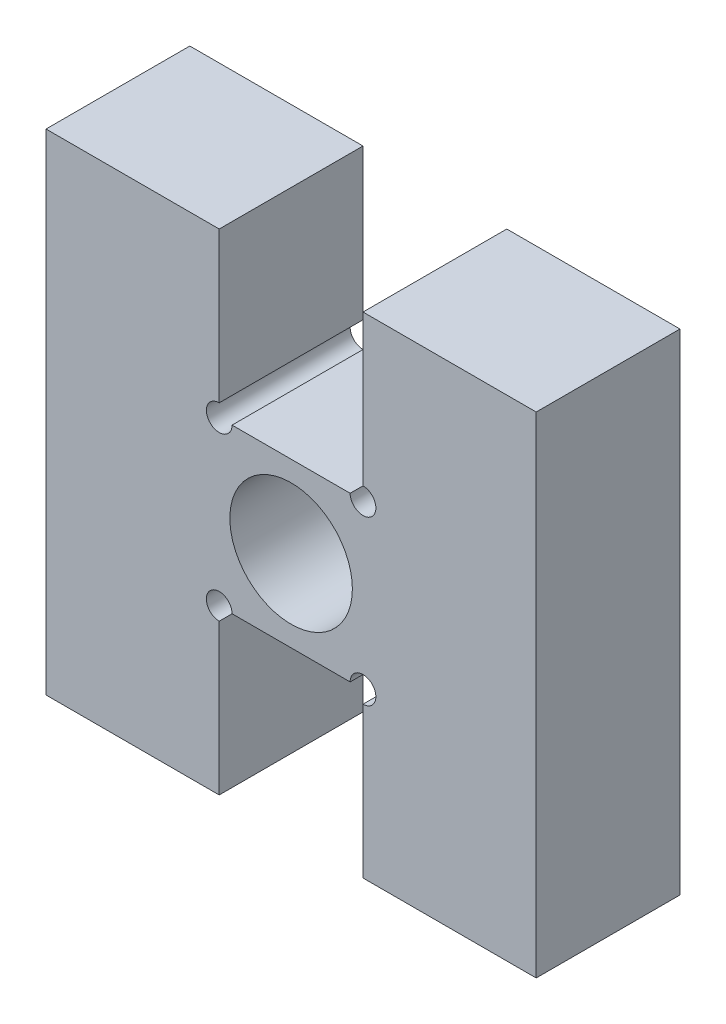
ISO-10303-21;
HEADER;
FILE_DESCRIPTION(('STEP AP214'),'2;1');
FILE_NAME('part.step','',(''),(''),'','','');
FILE_SCHEMA(('AUTOMOTIVE_DESIGN { 1 0 10303 214 1 1 1 1 }'));
ENDSEC;
DATA;
#1=APPLICATION_CONTEXT('core data for automotive mechanical design processes');
#2=APPLICATION_PROTOCOL_DEFINITION('international standard','automotive_design',2000,#1);
#3=PRODUCT_CONTEXT('',#1,'mechanical');
#4=PRODUCT('Part','Part','',(#3));
#5=PRODUCT_RELATED_PRODUCT_CATEGORY('part','',(#4));
#6=PRODUCT_DEFINITION_FORMATION('','',#4);
#7=PRODUCT_DEFINITION_CONTEXT('part definition',#1,'design');
#8=PRODUCT_DEFINITION('design','',#6,#7);
#9=PRODUCT_DEFINITION_SHAPE('','',#8);
#10=(LENGTH_UNIT() NAMED_UNIT(*) SI_UNIT(.MILLI.,.METRE.));
#11=(NAMED_UNIT(*) PLANE_ANGLE_UNIT() SI_UNIT($,.RADIAN.));
#12=(NAMED_UNIT(*) SI_UNIT($,.STERADIAN.) SOLID_ANGLE_UNIT());
#13=UNCERTAINTY_MEASURE_WITH_UNIT(LENGTH_MEASURE(1.E-05),#10,'distance_accuracy_value','');
#14=(GEOMETRIC_REPRESENTATION_CONTEXT(3) GLOBAL_UNCERTAINTY_ASSIGNED_CONTEXT((#13)) GLOBAL_UNIT_ASSIGNED_CONTEXT((#10,
#11,#12)) REPRESENTATION_CONTEXT('',''));
#15=CARTESIAN_POINT('',(0.,0.,0.));
#16=DIRECTION('',(0.,0.,1.));
#17=DIRECTION('',(1.,0.,0.));
#18=AXIS2_PLACEMENT_3D('',#15,#16,#17);
#19=CARTESIAN_POINT('',(-2.794,3.175,5.588));
#20=DIRECTION('',(0.,-1.,0.));
#21=DIRECTION('',(0.,0.,-1.));
#22=AXIS2_PLACEMENT_3D('',#19,#20,#21);
#23=PLANE('',#22);
#24=DIRECTION('',(0.,0.,-1.));
#25=VECTOR('',#24,1.);
#26=CARTESIAN_POINT('',(2.294,3.175,5.588));
#27=LINE('',#26,#25);
#28=CARTESIAN_POINT('',(2.294,3.175,0.));
#29=VERTEX_POINT('',#28);
#30=CARTESIAN_POINT('',(2.294,3.175,5.588));
#31=VERTEX_POINT('',#30);
#32=EDGE_CURVE('E143',#29,#31,#27,.F.);
#33=ORIENTED_EDGE('',*,*,#32,.F.);
#34=DIRECTION('',(-1.,0.,0.));
#35=VECTOR('',#34,1.);
#36=CARTESIAN_POINT('',(-2.794,3.175,0.));
#37=LINE('',#36,#35);
#38=CARTESIAN_POINT('',(-2.294,3.175,0.));
#39=VERTEX_POINT('',#38);
#40=EDGE_CURVE('E204',#29,#39,#37,.T.);
#41=ORIENTED_EDGE('',*,*,#40,.T.);
#42=DIRECTION('',(0.,0.,-1.));
#43=VECTOR('',#42,1.);
#44=CARTESIAN_POINT('',(-2.294,3.175,5.588));
#45=LINE('',#44,#43);
#46=CARTESIAN_POINT('',(-2.294,3.175,5.588));
#47=VERTEX_POINT('',#46);
#48=EDGE_CURVE('E170',#47,#39,#45,.T.);
#49=ORIENTED_EDGE('',*,*,#48,.F.);
#50=DIRECTION('',(-1.,0.,0.));
#51=VECTOR('',#50,1.);
#52=CARTESIAN_POINT('',(-2.794,3.175,5.588));
#53=LINE('',#52,#51);
#54=EDGE_CURVE('E163',#31,#47,#53,.T.);
#55=ORIENTED_EDGE('',*,*,#54,.F.);
#56=EDGE_LOOP('',(#33,#41,#49,#55));
#57=FACE_BOUND('',#56,.T.);
#58=ADVANCED_FACE('F33',(#57),#23,.F.);
#59=CARTESIAN_POINT('',(-2.794,3.175,5.588));
#60=DIRECTION('',(-1.,0.,0.));
#61=DIRECTION('',(0.,-1.,0.));
#62=AXIS2_PLACEMENT_3D('',#59,#60,#61);
#63=PLANE('',#62);
#64=DIRECTION('',(0.,0.,-1.));
#65=VECTOR('',#64,1.);
#66=CARTESIAN_POINT('',(-2.794,3.675,5.588));
#67=LINE('',#66,#65);
#68=CARTESIAN_POINT('',(-2.794,3.675,0.));
#69=VERTEX_POINT('',#68);
#70=CARTESIAN_POINT('',(-2.794,3.675,5.588));
#71=VERTEX_POINT('',#70);
#72=EDGE_CURVE('E11',#69,#71,#67,.F.);
#73=ORIENTED_EDGE('',*,*,#72,.F.);
#74=DIRECTION('',(0.,1.,0.));
#75=VECTOR('',#74,1.);
#76=CARTESIAN_POINT('',(-2.794,3.175,0.));
#77=LINE('',#76,#75);
#78=CARTESIAN_POINT('',(-2.794,9.525,0.));
#79=VERTEX_POINT('',#78);
#80=EDGE_CURVE('E206',#69,#79,#77,.T.);
#81=ORIENTED_EDGE('',*,*,#80,.T.);
#82=DIRECTION('',(0.,0.,-1.));
#83=VECTOR('',#82,1.);
#84=CARTESIAN_POINT('',(-2.794,9.525,5.588));
#85=LINE('',#84,#83);
#86=CARTESIAN_POINT('',(-2.794,9.525,5.588));
#87=VERTEX_POINT('',#86);
#88=EDGE_CURVE('E248',#87,#79,#85,.T.);
#89=ORIENTED_EDGE('',*,*,#88,.F.);
#90=DIRECTION('',(0.,1.,0.));
#91=VECTOR('',#90,1.);
#92=CARTESIAN_POINT('',(-2.794,3.175,5.588));
#93=LINE('',#92,#91);
#94=EDGE_CURVE('E171',#71,#87,#93,.T.);
#95=ORIENTED_EDGE('',*,*,#94,.F.);
#96=EDGE_LOOP('',(#73,#81,#89,#95));
#97=FACE_BOUND('',#96,.T.);
#98=ADVANCED_FACE('F299',(#97),#63,.F.);
#99=CARTESIAN_POINT('',(-2.794,-9.525,5.588));
#100=DIRECTION('',(-1.,0.,0.));
#101=DIRECTION('',(0.,-1.,0.));
#102=AXIS2_PLACEMENT_3D('',#99,#100,#101);
#103=PLANE('',#102);
#104=DIRECTION('',(0.,0.,-1.));
#105=VECTOR('',#104,1.);
#106=CARTESIAN_POINT('',(-2.794,-3.675,5.588));
#107=LINE('',#106,#105);
#108=CARTESIAN_POINT('',(-2.794,-3.675,5.588));
#109=VERTEX_POINT('',#108);
#110=CARTESIAN_POINT('',(-2.794,-3.675,0.));
#111=VERTEX_POINT('',#110);
#112=EDGE_CURVE('E269',#109,#111,#107,.T.);
#113=ORIENTED_EDGE('',*,*,#112,.F.);
#114=DIRECTION('',(0.,1.,0.));
#115=VECTOR('',#114,1.);
#116=CARTESIAN_POINT('',(-2.794,-9.525,5.588));
#117=LINE('',#116,#115);
#118=CARTESIAN_POINT('',(-2.794,-9.525,5.588));
#119=VERTEX_POINT('',#118);
#120=EDGE_CURVE('E188',#119,#109,#117,.T.);
#121=ORIENTED_EDGE('',*,*,#120,.F.);
#122=DIRECTION('',(0.,0.,-1.));
#123=VECTOR('',#122,1.);
#124=CARTESIAN_POINT('',(-2.794,-9.525,5.588));
#125=LINE('',#124,#123);
#126=CARTESIAN_POINT('',(-2.794,-9.525,0.));
#127=VERTEX_POINT('',#126);
#128=EDGE_CURVE('E239',#119,#127,#125,.T.);
#129=ORIENTED_EDGE('',*,*,#128,.T.);
#130=DIRECTION('',(0.,1.,0.));
#131=VECTOR('',#130,1.);
#132=CARTESIAN_POINT('',(-2.794,-9.525,0.));
#133=LINE('',#132,#131);
#134=EDGE_CURVE('E215',#127,#111,#133,.T.);
#135=ORIENTED_EDGE('',*,*,#134,.T.);
#136=EDGE_LOOP('',(#113,#121,#129,#135));
#137=FACE_BOUND('',#136,.T.);
#138=ADVANCED_FACE('F303',(#137),#103,.F.);
#139=CARTESIAN_POINT('',(-2.794,-3.175,5.588));
#140=DIRECTION('',(0.,1.,0.));
#141=DIRECTION('',(0.,0.,1.));
#142=AXIS2_PLACEMENT_3D('',#139,#140,#141);
#143=PLANE('',#142);
#144=DIRECTION('',(0.,0.,-1.));
#145=VECTOR('',#144,1.);
#146=CARTESIAN_POINT('',(-2.294,-3.175,5.588));
#147=LINE('',#146,#145);
#148=CARTESIAN_POINT('',(-2.294,-3.175,0.));
#149=VERTEX_POINT('',#148);
#150=CARTESIAN_POINT('',(-2.294,-3.175,5.588));
#151=VERTEX_POINT('',#150);
#152=EDGE_CURVE('E40',#149,#151,#147,.F.);
#153=ORIENTED_EDGE('',*,*,#152,.F.);
#154=DIRECTION('',(1.,0.,0.));
#155=VECTOR('',#154,1.);
#156=CARTESIAN_POINT('',(-2.794,-3.175,0.));
#157=LINE('',#156,#155);
#158=CARTESIAN_POINT('',(2.294,-3.175,0.));
#159=VERTEX_POINT('',#158);
#160=EDGE_CURVE('E218',#149,#159,#157,.T.);
#161=ORIENTED_EDGE('',*,*,#160,.T.);
#162=DIRECTION('',(0.,0.,-1.));
#163=VECTOR('',#162,1.);
#164=CARTESIAN_POINT('',(2.294,-3.175,5.588));
#165=LINE('',#164,#163);
#166=CARTESIAN_POINT('',(2.294,-3.175,5.588));
#167=VERTEX_POINT('',#166);
#168=EDGE_CURVE('E265',#167,#159,#165,.T.);
#169=ORIENTED_EDGE('',*,*,#168,.F.);
#170=DIRECTION('',(1.,0.,0.));
#171=VECTOR('',#170,1.);
#172=CARTESIAN_POINT('',(-2.794,-3.175,5.588));
#173=LINE('',#172,#171);
#174=EDGE_CURVE('E191',#151,#167,#173,.T.);
#175=ORIENTED_EDGE('',*,*,#174,.F.);
#176=EDGE_LOOP('',(#153,#161,#169,#175));
#177=FACE_BOUND('',#176,.T.);
#178=ADVANCED_FACE('F264',(#177),#143,.F.);
#179=CARTESIAN_POINT('',(2.794,-3.175,5.588));
#180=DIRECTION('',(1.,0.,0.));
#181=DIRECTION('',(0.,1.,0.));
#182=AXIS2_PLACEMENT_3D('',#179,#180,#181);
#183=PLANE('',#182);
#184=DIRECTION('',(0.,0.,-1.));
#185=VECTOR('',#184,1.);
#186=CARTESIAN_POINT('',(2.794,-3.675,5.588));
#187=LINE('',#186,#185);
#188=CARTESIAN_POINT('',(2.794,-3.675,0.));
#189=VERTEX_POINT('',#188);
#190=CARTESIAN_POINT('',(2.794,-3.675,5.588));
#191=VERTEX_POINT('',#190);
#192=EDGE_CURVE('E253',#189,#191,#187,.F.);
#193=ORIENTED_EDGE('',*,*,#192,.F.);
#194=DIRECTION('',(0.,-1.,0.));
#195=VECTOR('',#194,1.);
#196=CARTESIAN_POINT('',(2.794,-3.175,0.));
#197=LINE('',#196,#195);
#198=CARTESIAN_POINT('',(2.794,-9.525,0.));
#199=VERTEX_POINT('',#198);
#200=EDGE_CURVE('E221',#189,#199,#197,.T.);
#201=ORIENTED_EDGE('',*,*,#200,.T.);
#202=DIRECTION('',(0.,0.,-1.));
#203=VECTOR('',#202,1.);
#204=CARTESIAN_POINT('',(2.794,-9.525,5.588));
#205=LINE('',#204,#203);
#206=CARTESIAN_POINT('',(2.794,-9.525,5.588));
#207=VERTEX_POINT('',#206);
#208=EDGE_CURVE('E236',#207,#199,#205,.T.);
#209=ORIENTED_EDGE('',*,*,#208,.F.);
#210=DIRECTION('',(0.,-1.,0.));
#211=VECTOR('',#210,1.);
#212=CARTESIAN_POINT('',(2.794,-3.175,5.588));
#213=LINE('',#212,#211);
#214=EDGE_CURVE('E194',#191,#207,#213,.T.);
#215=ORIENTED_EDGE('',*,*,#214,.F.);
#216=EDGE_LOOP('',(#193,#201,#209,#215));
#217=FACE_BOUND('',#216,.T.);
#218=ADVANCED_FACE('F326',(#217),#183,.F.);
#219=CARTESIAN_POINT('',(2.794,9.525,5.588));
#220=DIRECTION('',(1.,0.,0.));
#221=DIRECTION('',(0.,1.,0.));
#222=AXIS2_PLACEMENT_3D('',#219,#220,#221);
#223=PLANE('',#222);
#224=DIRECTION('',(0.,0.,-1.));
#225=VECTOR('',#224,1.);
#226=CARTESIAN_POINT('',(2.794,3.675,5.588));
#227=LINE('',#226,#225);
#228=CARTESIAN_POINT('',(2.794,3.675,5.588));
#229=VERTEX_POINT('',#228);
#230=CARTESIAN_POINT('',(2.794,3.675,0.));
#231=VERTEX_POINT('',#230);
#232=EDGE_CURVE('E251',#229,#231,#227,.T.);
#233=ORIENTED_EDGE('',*,*,#232,.F.);
#234=DIRECTION('',(0.,-1.,0.));
#235=VECTOR('',#234,1.);
#236=CARTESIAN_POINT('',(2.794,9.525,5.588));
#237=LINE('',#236,#235);
#238=CARTESIAN_POINT('',(2.794,9.525,5.588));
#239=VERTEX_POINT('',#238);
#240=EDGE_CURVE('E165',#239,#229,#237,.T.);
#241=ORIENTED_EDGE('',*,*,#240,.F.);
#242=DIRECTION('',(0.,0.,-1.));
#243=VECTOR('',#242,1.);
#244=CARTESIAN_POINT('',(2.794,9.525,5.588));
#245=LINE('',#244,#243);
#246=CARTESIAN_POINT('',(2.794,9.525,0.));
#247=VERTEX_POINT('',#246);
#248=EDGE_CURVE('E203',#239,#247,#245,.T.);
#249=ORIENTED_EDGE('',*,*,#248,.T.);
#250=DIRECTION('',(0.,-1.,0.));
#251=VECTOR('',#250,1.);
#252=CARTESIAN_POINT('',(2.794,9.525,0.));
#253=LINE('',#252,#251);
#254=EDGE_CURVE('E172',#247,#231,#253,.T.);
#255=ORIENTED_EDGE('',*,*,#254,.T.);
#256=EDGE_LOOP('',(#233,#241,#249,#255));
#257=FACE_BOUND('',#256,.T.);
#258=ADVANCED_FACE('F329',(#257),#223,.F.);
#259=CARTESIAN_POINT('',(0.,0.,5.588));
#260=DIRECTION('',(0.,0.,-1.));
#261=DIRECTION('',(-1.,0.,0.));
#262=AXIS2_PLACEMENT_3D('',#259,#260,#261);
#263=PLANE('',#262);
#264=CARTESIAN_POINT('',(-2.794,-3.175,5.588));
#265=DIRECTION('',(0.,0.,1.));
#266=DIRECTION('',(1.,0.,0.));
#267=AXIS2_PLACEMENT_3D('',#264,#265,#266);
#268=CIRCLE('',#267,0.5);
#269=EDGE_CURVE('E255',#151,#109,#268,.T.);
#270=ORIENTED_EDGE('',*,*,#269,.F.);
#271=ORIENTED_EDGE('',*,*,#174,.T.);
#272=CARTESIAN_POINT('',(2.794,-3.175,5.588));
#273=DIRECTION('',(0.,0.,1.));
#274=DIRECTION('',(1.,0.,0.));
#275=AXIS2_PLACEMENT_3D('',#272,#273,#274);
#276=CIRCLE('',#275,0.5);
#277=EDGE_CURVE('E167',#191,#167,#276,.T.);
#278=ORIENTED_EDGE('',*,*,#277,.F.);
#279=ORIENTED_EDGE('',*,*,#214,.T.);
#280=DIRECTION('',(1.,0.,0.));
#281=VECTOR('',#280,1.);
#282=CARTESIAN_POINT('',(2.794,-9.525,5.588));
#283=LINE('',#282,#281);
#284=CARTESIAN_POINT('',(9.525,-9.525,5.588));
#285=VERTEX_POINT('',#284);
#286=EDGE_CURVE('E196',#207,#285,#283,.T.);
#287=ORIENTED_EDGE('',*,*,#286,.T.);
#288=DIRECTION('',(0.,1.,0.));
#289=VECTOR('',#288,1.);
#290=CARTESIAN_POINT('',(9.525,-9.525,5.588));
#291=LINE('',#290,#289);
#292=CARTESIAN_POINT('',(9.525,9.525,5.588));
#293=VERTEX_POINT('',#292);
#294=EDGE_CURVE('E198',#285,#293,#291,.T.);
#295=ORIENTED_EDGE('',*,*,#294,.T.);
#296=DIRECTION('',(-1.,0.,0.));
#297=VECTOR('',#296,1.);
#298=CARTESIAN_POINT('',(9.525,9.525,5.588));
#299=LINE('',#298,#297);
#300=EDGE_CURVE('E200',#293,#239,#299,.T.);
#301=ORIENTED_EDGE('',*,*,#300,.T.);
#302=ORIENTED_EDGE('',*,*,#240,.T.);
#303=CARTESIAN_POINT('',(2.794,3.175,5.588));
#304=DIRECTION('',(0.,0.,1.));
#305=DIRECTION('',(1.,0.,0.));
#306=AXIS2_PLACEMENT_3D('',#303,#304,#305);
#307=CIRCLE('',#306,0.5);
#308=EDGE_CURVE('E146',#31,#229,#307,.T.);
#309=ORIENTED_EDGE('',*,*,#308,.F.);
#310=ORIENTED_EDGE('',*,*,#54,.T.);
#311=CARTESIAN_POINT('',(-2.794,3.175,5.588));
#312=DIRECTION('',(0.,0.,1.));
#313=DIRECTION('',(1.,0.,0.));
#314=AXIS2_PLACEMENT_3D('',#311,#312,#313);
#315=CIRCLE('',#314,0.5);
#316=EDGE_CURVE('E166',#71,#47,#315,.T.);
#317=ORIENTED_EDGE('',*,*,#316,.F.);
#318=ORIENTED_EDGE('',*,*,#94,.T.);
#319=DIRECTION('',(-1.,0.,0.));
#320=VECTOR('',#319,1.);
#321=CARTESIAN_POINT('',(-2.794,9.525,5.588));
#322=LINE('',#321,#320);
#323=CARTESIAN_POINT('',(-9.525,9.525,5.588));
#324=VERTEX_POINT('',#323);
#325=EDGE_CURVE('E174',#87,#324,#322,.T.);
#326=ORIENTED_EDGE('',*,*,#325,.T.);
#327=DIRECTION('',(0.,-1.,0.));
#328=VECTOR('',#327,1.);
#329=CARTESIAN_POINT('',(-9.525,9.525,5.588));
#330=LINE('',#329,#328);
#331=CARTESIAN_POINT('',(-9.525,-9.525,5.588));
#332=VERTEX_POINT('',#331);
#333=EDGE_CURVE('E184',#324,#332,#330,.T.);
#334=ORIENTED_EDGE('',*,*,#333,.T.);
#335=DIRECTION('',(1.,0.,0.));
#336=VECTOR('',#335,1.);
#337=CARTESIAN_POINT('',(-9.525,-9.525,5.588));
#338=LINE('',#337,#336);
#339=EDGE_CURVE('E186',#332,#119,#338,.T.);
#340=ORIENTED_EDGE('',*,*,#339,.T.);
#341=ORIENTED_EDGE('',*,*,#120,.T.);
#342=EDGE_LOOP('',(#270,#271,#278,#279,#287,#295,#301,#302,#309,#310,#317,#318,#326,#334,#340,#341));
#343=FACE_BOUND('',#342,.T.);
#344=CARTESIAN_POINT('',(0.,0.,5.588));
#345=DIRECTION('',(0.,0.,1.));
#346=DIRECTION('',(1.,0.,0.));
#347=AXIS2_PLACEMENT_3D('',#344,#345,#346);
#348=CIRCLE('',#347,2.38125);
#349=CARTESIAN_POINT('',(2.38125,0.,5.588));
#350=VERTEX_POINT('',#349);
#351=EDGE_CURVE('E207',#350,#350,#348,.T.);
#352=ORIENTED_EDGE('',*,*,#351,.F.);
#353=EDGE_LOOP('',(#352));
#354=FACE_BOUND('',#353,.T.);
#355=ADVANCED_FACE('F160',(#343,#354),#263,.F.);
#356=CARTESIAN_POINT('',(0.,0.,0.));
#357=DIRECTION('',(0.,0.,-1.));
#358=DIRECTION('',(-1.,0.,0.));
#359=AXIS2_PLACEMENT_3D('',#356,#357,#358);
#360=PLANE('',#359);
#361=ORIENTED_EDGE('',*,*,#160,.F.);
#362=CARTESIAN_POINT('',(-2.794,-3.175,0.));
#363=DIRECTION('',(0.,0.,-1.));
#364=DIRECTION('',(-1.,0.,0.));
#365=AXIS2_PLACEMENT_3D('',#362,#363,#364);
#366=CIRCLE('',#365,0.5);
#367=EDGE_CURVE('E54',#149,#111,#366,.F.);
#368=ORIENTED_EDGE('',*,*,#367,.T.);
#369=ORIENTED_EDGE('',*,*,#134,.F.);
#370=DIRECTION('',(1.,0.,0.));
#371=VECTOR('',#370,1.);
#372=CARTESIAN_POINT('',(-9.525,-9.525,0.));
#373=LINE('',#372,#371);
#374=CARTESIAN_POINT('',(-9.525,-9.525,0.));
#375=VERTEX_POINT('',#374);
#376=EDGE_CURVE('E213',#375,#127,#373,.T.);
#377=ORIENTED_EDGE('',*,*,#376,.F.);
#378=DIRECTION('',(0.,-1.,0.));
#379=VECTOR('',#378,1.);
#380=CARTESIAN_POINT('',(-9.525,9.525,0.));
#381=LINE('',#380,#379);
#382=CARTESIAN_POINT('',(-9.525,9.525,0.));
#383=VERTEX_POINT('',#382);
#384=EDGE_CURVE('E211',#383,#375,#381,.T.);
#385=ORIENTED_EDGE('',*,*,#384,.F.);
#386=DIRECTION('',(-1.,0.,0.));
#387=VECTOR('',#386,1.);
#388=CARTESIAN_POINT('',(-2.794,9.525,0.));
#389=LINE('',#388,#387);
#390=EDGE_CURVE('E209',#79,#383,#389,.T.);
#391=ORIENTED_EDGE('',*,*,#390,.F.);
#392=ORIENTED_EDGE('',*,*,#80,.F.);
#393=CARTESIAN_POINT('',(-2.794,3.175,0.));
#394=DIRECTION('',(0.,0.,-1.));
#395=DIRECTION('',(-1.,0.,0.));
#396=AXIS2_PLACEMENT_3D('',#393,#394,#395);
#397=CIRCLE('',#396,0.5);
#398=EDGE_CURVE('E46',#69,#39,#397,.F.);
#399=ORIENTED_EDGE('',*,*,#398,.T.);
#400=ORIENTED_EDGE('',*,*,#40,.F.);
#401=CARTESIAN_POINT('',(2.794,3.175,0.));
#402=DIRECTION('',(0.,0.,-1.));
#403=DIRECTION('',(-1.,0.,0.));
#404=AXIS2_PLACEMENT_3D('',#401,#402,#403);
#405=CIRCLE('',#404,0.5);
#406=EDGE_CURVE('E149',#29,#231,#405,.F.);
#407=ORIENTED_EDGE('',*,*,#406,.T.);
#408=ORIENTED_EDGE('',*,*,#254,.F.);
#409=DIRECTION('',(-1.,0.,0.));
#410=VECTOR('',#409,1.);
#411=CARTESIAN_POINT('',(9.525,9.525,0.));
#412=LINE('',#411,#410);
#413=CARTESIAN_POINT('',(9.525,9.525,0.));
#414=VERTEX_POINT('',#413);
#415=EDGE_CURVE('E177',#414,#247,#412,.T.);
#416=ORIENTED_EDGE('',*,*,#415,.F.);
#417=DIRECTION('',(0.,1.,0.));
#418=VECTOR('',#417,1.);
#419=CARTESIAN_POINT('',(9.525,-9.525,0.));
#420=LINE('',#419,#418);
#421=CARTESIAN_POINT('',(9.525,-9.525,0.));
#422=VERTEX_POINT('',#421);
#423=EDGE_CURVE('E225',#422,#414,#420,.T.);
#424=ORIENTED_EDGE('',*,*,#423,.F.);
#425=DIRECTION('',(1.,0.,0.));
#426=VECTOR('',#425,1.);
#427=CARTESIAN_POINT('',(2.794,-9.525,0.));
#428=LINE('',#427,#426);
#429=EDGE_CURVE('E223',#199,#422,#428,.T.);
#430=ORIENTED_EDGE('',*,*,#429,.F.);
#431=ORIENTED_EDGE('',*,*,#200,.F.);
#432=CARTESIAN_POINT('',(2.794,-3.175,0.));
#433=DIRECTION('',(0.,0.,-1.));
#434=DIRECTION('',(-1.,0.,0.));
#435=AXIS2_PLACEMENT_3D('',#432,#433,#434);
#436=CIRCLE('',#435,0.5);
#437=EDGE_CURVE('E154',#189,#159,#436,.F.);
#438=ORIENTED_EDGE('',*,*,#437,.T.);
#439=EDGE_LOOP('',(#361,#368,#369,#377,#385,#391,#392,#399,#400,#407,#408,#416,#424,#430,#431,#438));
#440=FACE_BOUND('',#439,.T.);
#441=CARTESIAN_POINT('',(0.,0.,0.));
#442=DIRECTION('',(0.,0.,1.));
#443=DIRECTION('',(1.,0.,0.));
#444=AXIS2_PLACEMENT_3D('',#441,#442,#443);
#445=CIRCLE('',#444,2.38125);
#446=CARTESIAN_POINT('',(2.38125,0.,0.));
#447=VERTEX_POINT('',#446);
#448=EDGE_CURVE('E180',#447,#447,#445,.T.);
#449=ORIENTED_EDGE('',*,*,#448,.T.);
#450=EDGE_LOOP('',(#449));
#451=FACE_BOUND('',#450,.T.);
#452=ADVANCED_FACE('F281',(#440,#451),#360,.T.);
#453=CARTESIAN_POINT('',(-2.794,9.525,5.588));
#454=DIRECTION('',(0.,-1.,0.));
#455=DIRECTION('',(1.,0.,0.));
#456=AXIS2_PLACEMENT_3D('',#453,#454,#455);
#457=PLANE('',#456);
#458=ORIENTED_EDGE('',*,*,#390,.T.);
#459=DIRECTION('',(0.,0.,-1.));
#460=VECTOR('',#459,1.);
#461=CARTESIAN_POINT('',(-9.525,9.525,5.588));
#462=LINE('',#461,#460);
#463=EDGE_CURVE('E245',#324,#383,#462,.T.);
#464=ORIENTED_EDGE('',*,*,#463,.F.);
#465=ORIENTED_EDGE('',*,*,#325,.F.);
#466=ORIENTED_EDGE('',*,*,#88,.T.);
#467=EDGE_LOOP('',(#458,#464,#465,#466));
#468=FACE_BOUND('',#467,.T.);
#469=ADVANCED_FACE('F311',(#468),#457,.F.);
#470=CARTESIAN_POINT('',(-9.525,9.525,5.588));
#471=DIRECTION('',(1.,0.,0.));
#472=DIRECTION('',(0.,0.,-1.));
#473=AXIS2_PLACEMENT_3D('',#470,#471,#472);
#474=PLANE('',#473);
#475=ORIENTED_EDGE('',*,*,#384,.T.);
#476=DIRECTION('',(0.,0.,-1.));
#477=VECTOR('',#476,1.);
#478=CARTESIAN_POINT('',(-9.525,-9.525,5.588));
#479=LINE('',#478,#477);
#480=EDGE_CURVE('E242',#332,#375,#479,.T.);
#481=ORIENTED_EDGE('',*,*,#480,.F.);
#482=ORIENTED_EDGE('',*,*,#333,.F.);
#483=ORIENTED_EDGE('',*,*,#463,.T.);
#484=EDGE_LOOP('',(#475,#481,#482,#483));
#485=FACE_BOUND('',#484,.T.);
#486=ADVANCED_FACE('F314',(#485),#474,.F.);
#487=CARTESIAN_POINT('',(-9.525,-9.525,5.588));
#488=DIRECTION('',(0.,1.,0.));
#489=DIRECTION('',(-1.,0.,0.));
#490=AXIS2_PLACEMENT_3D('',#487,#488,#489);
#491=PLANE('',#490);
#492=ORIENTED_EDGE('',*,*,#376,.T.);
#493=ORIENTED_EDGE('',*,*,#128,.F.);
#494=ORIENTED_EDGE('',*,*,#339,.F.);
#495=ORIENTED_EDGE('',*,*,#480,.T.);
#496=EDGE_LOOP('',(#492,#493,#494,#495));
#497=FACE_BOUND('',#496,.T.);
#498=ADVANCED_FACE('F318',(#497),#491,.F.);
#499=CARTESIAN_POINT('',(2.794,-9.525,5.588));
#500=DIRECTION('',(0.,1.,0.));
#501=DIRECTION('',(0.,0.,1.));
#502=AXIS2_PLACEMENT_3D('',#499,#500,#501);
#503=PLANE('',#502);
#504=ORIENTED_EDGE('',*,*,#429,.T.);
#505=DIRECTION('',(0.,0.,-1.));
#506=VECTOR('',#505,1.);
#507=CARTESIAN_POINT('',(9.525,-9.525,5.588));
#508=LINE('',#507,#506);
#509=EDGE_CURVE('E233',#285,#422,#508,.T.);
#510=ORIENTED_EDGE('',*,*,#509,.F.);
#511=ORIENTED_EDGE('',*,*,#286,.F.);
#512=ORIENTED_EDGE('',*,*,#208,.T.);
#513=EDGE_LOOP('',(#504,#510,#511,#512));
#514=FACE_BOUND('',#513,.T.);
#515=ADVANCED_FACE('F321',(#514),#503,.F.);
#516=CARTESIAN_POINT('',(9.525,-9.525,5.588));
#517=DIRECTION('',(-1.,0.,0.));
#518=DIRECTION('',(0.,0.,1.));
#519=AXIS2_PLACEMENT_3D('',#516,#517,#518);
#520=PLANE('',#519);
#521=ORIENTED_EDGE('',*,*,#423,.T.);
#522=DIRECTION('',(0.,0.,-1.));
#523=VECTOR('',#522,1.);
#524=CARTESIAN_POINT('',(9.525,9.525,5.588));
#525=LINE('',#524,#523);
#526=EDGE_CURVE('E230',#293,#414,#525,.T.);
#527=ORIENTED_EDGE('',*,*,#526,.F.);
#528=ORIENTED_EDGE('',*,*,#294,.F.);
#529=ORIENTED_EDGE('',*,*,#509,.T.);
#530=EDGE_LOOP('',(#521,#527,#528,#529));
#531=FACE_BOUND('',#530,.T.);
#532=ADVANCED_FACE('F293',(#531),#520,.F.);
#533=CARTESIAN_POINT('',(9.525,9.525,5.588));
#534=DIRECTION('',(0.,-1.,0.));
#535=DIRECTION('',(0.,0.,-1.));
#536=AXIS2_PLACEMENT_3D('',#533,#534,#535);
#537=PLANE('',#536);
#538=ORIENTED_EDGE('',*,*,#415,.T.);
#539=ORIENTED_EDGE('',*,*,#248,.F.);
#540=ORIENTED_EDGE('',*,*,#300,.F.);
#541=ORIENTED_EDGE('',*,*,#526,.T.);
#542=EDGE_LOOP('',(#538,#539,#540,#541));
#543=FACE_BOUND('',#542,.T.);
#544=ADVANCED_FACE('F285',(#543),#537,.F.);
#545=CARTESIAN_POINT('',(0.,0.,5.588));
#546=DIRECTION('',(0.,0.,-1.));
#547=DIRECTION('',(-1.,0.,0.));
#548=AXIS2_PLACEMENT_3D('',#545,#546,#547);
#549=CYLINDRICAL_SURFACE('',#548,2.38125);
#550=ORIENTED_EDGE('',*,*,#351,.T.);
#551=EDGE_LOOP('',(#550));
#552=FACE_BOUND('',#551,.T.);
#553=ORIENTED_EDGE('',*,*,#448,.F.);
#554=EDGE_LOOP('',(#553));
#555=FACE_BOUND('',#554,.T.);
#556=ADVANCED_FACE('F283',(#552,#555),#549,.F.);
#557=CARTESIAN_POINT('',(2.794,3.175,5.588));
#558=DIRECTION('',(0.,0.,-1.));
#559=DIRECTION('',(-1.,0.,0.));
#560=AXIS2_PLACEMENT_3D('',#557,#558,#559);
#561=CYLINDRICAL_SURFACE('',#560,0.5);
#562=ORIENTED_EDGE('',*,*,#32,.T.);
#563=ORIENTED_EDGE('',*,*,#308,.T.);
#564=ORIENTED_EDGE('',*,*,#232,.T.);
#565=ORIENTED_EDGE('',*,*,#406,.F.);
#566=EDGE_LOOP('',(#562,#563,#564,#565));
#567=FACE_BOUND('',#566,.T.);
#568=ADVANCED_FACE('F145',(#567),#561,.F.);
#569=CARTESIAN_POINT('',(2.794,-3.175,5.588));
#570=DIRECTION('',(0.,0.,-1.));
#571=DIRECTION('',(-1.,0.,0.));
#572=AXIS2_PLACEMENT_3D('',#569,#570,#571);
#573=CYLINDRICAL_SURFACE('',#572,0.5);
#574=ORIENTED_EDGE('',*,*,#168,.T.);
#575=ORIENTED_EDGE('',*,*,#437,.F.);
#576=ORIENTED_EDGE('',*,*,#192,.T.);
#577=ORIENTED_EDGE('',*,*,#277,.T.);
#578=EDGE_LOOP('',(#574,#575,#576,#577));
#579=FACE_BOUND('',#578,.T.);
#580=ADVANCED_FACE('F291',(#579),#573,.F.);
#581=CARTESIAN_POINT('',(-2.794,-3.175,5.588));
#582=DIRECTION('',(0.,0.,-1.));
#583=DIRECTION('',(-1.,0.,0.));
#584=AXIS2_PLACEMENT_3D('',#581,#582,#583);
#585=CYLINDRICAL_SURFACE('',#584,0.5);
#586=ORIENTED_EDGE('',*,*,#112,.T.);
#587=ORIENTED_EDGE('',*,*,#367,.F.);
#588=ORIENTED_EDGE('',*,*,#152,.T.);
#589=ORIENTED_EDGE('',*,*,#269,.T.);
#590=EDGE_LOOP('',(#586,#587,#588,#589));
#591=FACE_BOUND('',#590,.T.);
#592=ADVANCED_FACE('F254',(#591),#585,.F.);
#593=CARTESIAN_POINT('',(-2.794,3.175,5.588));
#594=DIRECTION('',(0.,0.,-1.));
#595=DIRECTION('',(-1.,0.,0.));
#596=AXIS2_PLACEMENT_3D('',#593,#594,#595);
#597=CYLINDRICAL_SURFACE('',#596,0.5);
#598=ORIENTED_EDGE('',*,*,#48,.T.);
#599=ORIENTED_EDGE('',*,*,#398,.F.);
#600=ORIENTED_EDGE('',*,*,#72,.T.);
#601=ORIENTED_EDGE('',*,*,#316,.T.);
#602=EDGE_LOOP('',(#598,#599,#600,#601));
#603=FACE_BOUND('',#602,.T.);
#604=ADVANCED_FACE('F431',(#603),#597,.F.);
#605=CLOSED_SHELL('',(#58,#98,#138,#178,#218,#258,#355,#452,#469,#486,#498,#515,#532,#544,#556,
#568,#580,#592,#604));
#606=MANIFOLD_SOLID_BREP('B2',#605);
#607=ADVANCED_BREP_SHAPE_REPRESENTATION('',(#18,#606),#14);
#608=SHAPE_DEFINITION_REPRESENTATION(#9,#607);
ENDSEC;
END-ISO-10303-21;
